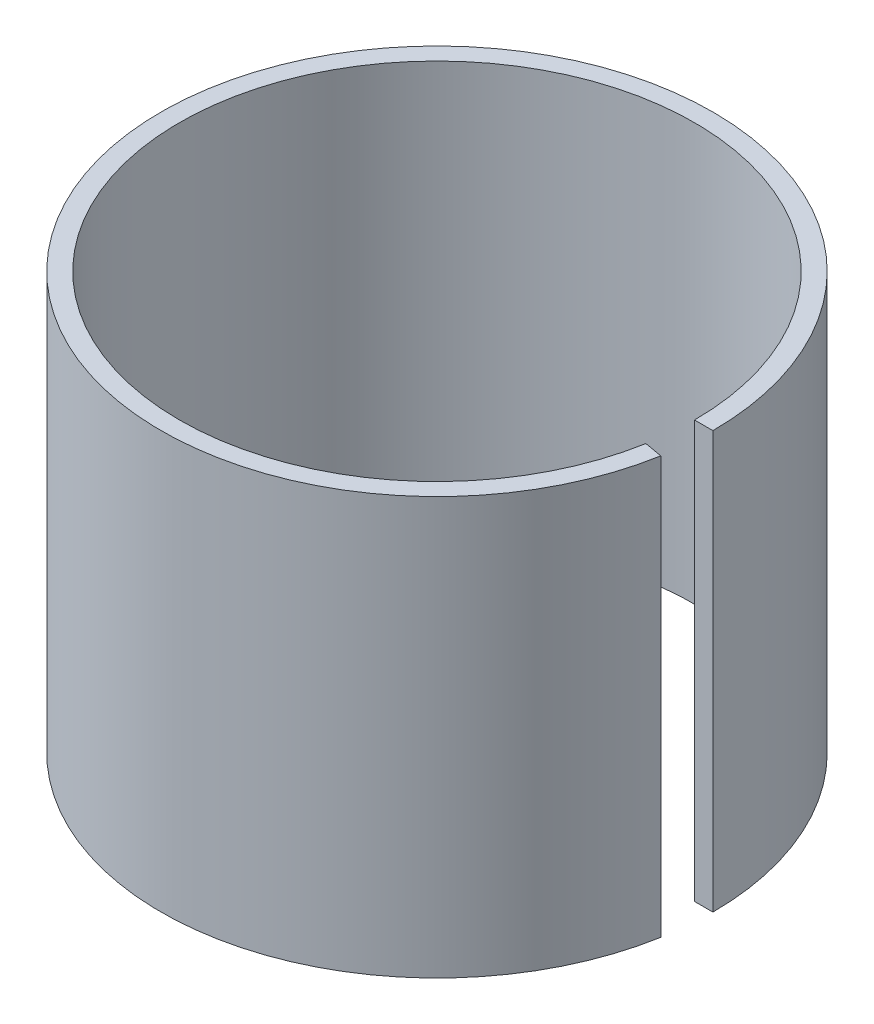
ISO-10303-21;
HEADER;
FILE_DESCRIPTION(('STEP AP214'),'2;1');
FILE_NAME('part.step','',(''),(''),'','','');
FILE_SCHEMA(('AUTOMOTIVE_DESIGN { 1 0 10303 214 1 1 1 1 }'));
ENDSEC;
DATA;
#1=APPLICATION_CONTEXT('core data for automotive mechanical design processes');
#2=APPLICATION_PROTOCOL_DEFINITION('international standard','automotive_design',2000,#1);
#3=PRODUCT_CONTEXT('',#1,'mechanical');
#4=PRODUCT('Part','Part','',(#3));
#5=PRODUCT_RELATED_PRODUCT_CATEGORY('part','',(#4));
#6=PRODUCT_DEFINITION_FORMATION('','',#4);
#7=PRODUCT_DEFINITION_CONTEXT('part definition',#1,'design');
#8=PRODUCT_DEFINITION('design','',#6,#7);
#9=PRODUCT_DEFINITION_SHAPE('','',#8);
#10=(LENGTH_UNIT() NAMED_UNIT(*) SI_UNIT(.MILLI.,.METRE.));
#11=(NAMED_UNIT(*) PLANE_ANGLE_UNIT() SI_UNIT($,.RADIAN.));
#12=(NAMED_UNIT(*) SI_UNIT($,.STERADIAN.) SOLID_ANGLE_UNIT());
#13=UNCERTAINTY_MEASURE_WITH_UNIT(LENGTH_MEASURE(1.E-05),#10,'distance_accuracy_value','');
#14=(GEOMETRIC_REPRESENTATION_CONTEXT(3) GLOBAL_UNCERTAINTY_ASSIGNED_CONTEXT((#13)) GLOBAL_UNIT_ASSIGNED_CONTEXT((#10,
#11,#12)) REPRESENTATION_CONTEXT('',''));
#15=CARTESIAN_POINT('',(0.,0.,0.));
#16=DIRECTION('',(0.,0.,1.));
#17=DIRECTION('',(1.,0.,0.));
#18=AXIS2_PLACEMENT_3D('',#15,#16,#17);
#19=CARTESIAN_POINT('',(0.,0.,0.));
#20=DIRECTION('',(0.,-1.,0.));
#21=DIRECTION('',(0.,0.,-1.));
#22=AXIS2_PLACEMENT_3D('',#19,#20,#21);
#23=CYLINDRICAL_SURFACE('',#22,22.5);
#24=CARTESIAN_POINT('',(0.,0.,0.));
#25=DIRECTION('',(0.,-1.,0.));
#26=DIRECTION('',(0.,0.,-1.));
#27=AXIS2_PLACEMENT_3D('',#24,#25,#26);
#28=CIRCLE('',#27,22.5);
#29=CARTESIAN_POINT('',(22.1581744427747,0.,3.90708399750564));
#30=VERTEX_POINT('',#29);
#31=CARTESIAN_POINT('',(22.5,0.,0.));
#32=VERTEX_POINT('',#31);
#33=EDGE_CURVE('E11',#30,#32,#28,.T.);
#34=ORIENTED_EDGE('',*,*,#33,.F.);
#35=DIRECTION('',(0.,1.,0.));
#36=VECTOR('',#35,1.);
#37=CARTESIAN_POINT('',(22.1581744427747,0.,3.90708399750564));
#38=LINE('',#37,#36);
#39=CARTESIAN_POINT('',(22.1581744427747,34.,3.90708399750564));
#40=VERTEX_POINT('',#39);
#41=EDGE_CURVE('E79',#30,#40,#38,.T.);
#42=ORIENTED_EDGE('',*,*,#41,.T.);
#43=CARTESIAN_POINT('',(0.,34.,0.));
#44=DIRECTION('',(0.,-1.,0.));
#45=DIRECTION('',(0.,0.,-1.));
#46=AXIS2_PLACEMENT_3D('',#43,#44,#45);
#47=CIRCLE('',#46,22.5);
#48=CARTESIAN_POINT('',(22.5,34.,0.));
#49=VERTEX_POINT('',#48);
#50=EDGE_CURVE('E74',#40,#49,#47,.T.);
#51=ORIENTED_EDGE('',*,*,#50,.T.);
#52=DIRECTION('',(0.,1.,0.));
#53=VECTOR('',#52,1.);
#54=CARTESIAN_POINT('',(22.5,0.,0.));
#55=LINE('',#54,#53);
#56=EDGE_CURVE('E77',#32,#49,#55,.T.);
#57=ORIENTED_EDGE('',*,*,#56,.F.);
#58=EDGE_LOOP('',(#34,#42,#51,#57));
#59=FACE_BOUND('',#58,.T.);
#60=ADVANCED_FACE('F38',(#59),#23,.T.);
#61=CARTESIAN_POINT('',(22.1581744427747,0.,3.90708399750564));
#62=DIRECTION('',(0.,1.,0.));
#63=DIRECTION('',(0.,0.,1.));
#64=AXIS2_PLACEMENT_3D('',#61,#62,#63);
#65=PLANE('',#64);
#66=CARTESIAN_POINT('',(0.,0.,0.));
#67=DIRECTION('',(0.,-1.,0.));
#68=DIRECTION('',(0.,0.,-1.));
#69=AXIS2_PLACEMENT_3D('',#66,#67,#68);
#70=CIRCLE('',#69,21.);
#71=CARTESIAN_POINT('',(20.6809628132564,0.,3.64661173100526));
#72=VERTEX_POINT('',#71);
#73=CARTESIAN_POINT('',(21.,0.,0.));
#74=VERTEX_POINT('',#73);
#75=EDGE_CURVE('E46',#72,#74,#70,.T.);
#76=ORIENTED_EDGE('',*,*,#75,.F.);
#77=DIRECTION('',(-0.98480775301221,0.,-0.173648177666917));
#78=VECTOR('',#77,1.);
#79=CARTESIAN_POINT('',(22.1581744427747,0.,3.90708399750564));
#80=LINE('',#79,#78);
#81=EDGE_CURVE('E84',#30,#72,#80,.T.);
#82=ORIENTED_EDGE('',*,*,#81,.F.);
#83=ORIENTED_EDGE('',*,*,#33,.T.);
#84=DIRECTION('',(-1.,0.,0.));
#85=VECTOR('',#84,1.);
#86=CARTESIAN_POINT('',(22.5,0.,0.));
#87=LINE('',#86,#85);
#88=EDGE_CURVE('E96',#32,#74,#87,.T.);
#89=ORIENTED_EDGE('',*,*,#88,.T.);
#90=EDGE_LOOP('',(#76,#82,#83,#89));
#91=FACE_BOUND('',#90,.T.);
#92=ADVANCED_FACE('F40',(#91),#65,.F.);
#93=CARTESIAN_POINT('',(0.,0.,0.));
#94=DIRECTION('',(0.,-1.,0.));
#95=DIRECTION('',(0.,0.,-1.));
#96=AXIS2_PLACEMENT_3D('',#93,#94,#95);
#97=CYLINDRICAL_SURFACE('',#96,21.);
#98=CARTESIAN_POINT('',(0.,34.,0.));
#99=DIRECTION('',(0.,-1.,0.));
#100=DIRECTION('',(0.,0.,-1.));
#101=AXIS2_PLACEMENT_3D('',#98,#99,#100);
#102=CIRCLE('',#101,21.);
#103=CARTESIAN_POINT('',(20.6809628132564,34.,3.64661173100526));
#104=VERTEX_POINT('',#103);
#105=CARTESIAN_POINT('',(21.,34.,0.));
#106=VERTEX_POINT('',#105);
#107=EDGE_CURVE('E83',#104,#106,#102,.T.);
#108=ORIENTED_EDGE('',*,*,#107,.F.);
#109=DIRECTION('',(0.,1.,0.));
#110=VECTOR('',#109,1.);
#111=CARTESIAN_POINT('',(20.6809628132564,0.,3.64661173100526));
#112=LINE('',#111,#110);
#113=EDGE_CURVE('E104',#72,#104,#112,.T.);
#114=ORIENTED_EDGE('',*,*,#113,.F.);
#115=ORIENTED_EDGE('',*,*,#75,.T.);
#116=DIRECTION('',(0.,1.,0.));
#117=VECTOR('',#116,1.);
#118=CARTESIAN_POINT('',(21.,0.,0.));
#119=LINE('',#118,#117);
#120=EDGE_CURVE('E92',#74,#106,#119,.T.);
#121=ORIENTED_EDGE('',*,*,#120,.T.);
#122=EDGE_LOOP('',(#108,#114,#115,#121));
#123=FACE_BOUND('',#122,.T.);
#124=ADVANCED_FACE('F110',(#123),#97,.F.);
#125=CARTESIAN_POINT('',(20.6809628132564,34.,3.64661173100526));
#126=DIRECTION('',(0.,-1.,0.));
#127=DIRECTION('',(0.,0.,-1.));
#128=AXIS2_PLACEMENT_3D('',#125,#126,#127);
#129=PLANE('',#128);
#130=DIRECTION('',(0.98480775301221,0.,0.173648177666917));
#131=VECTOR('',#130,1.);
#132=CARTESIAN_POINT('',(20.6809628132564,34.,3.64661173100526));
#133=LINE('',#132,#131);
#134=EDGE_CURVE('E102',#104,#40,#133,.T.);
#135=ORIENTED_EDGE('',*,*,#134,.F.);
#136=ORIENTED_EDGE('',*,*,#107,.T.);
#137=DIRECTION('',(1.,0.,0.));
#138=VECTOR('',#137,1.);
#139=CARTESIAN_POINT('',(21.,34.,0.));
#140=LINE('',#139,#138);
#141=EDGE_CURVE('E87',#106,#49,#140,.T.);
#142=ORIENTED_EDGE('',*,*,#141,.T.);
#143=ORIENTED_EDGE('',*,*,#50,.F.);
#144=EDGE_LOOP('',(#135,#136,#142,#143));
#145=FACE_BOUND('',#144,.T.);
#146=ADVANCED_FACE('F88',(#145),#129,.F.);
#147=CARTESIAN_POINT('',(0.,0.,0.));
#148=DIRECTION('',(0.173648177666917,0.,-0.98480775301221));
#149=DIRECTION('',(-0.98480775301221,0.,-0.173648177666917));
#150=AXIS2_PLACEMENT_3D('',#147,#148,#149);
#151=PLANE('',#150);
#152=ORIENTED_EDGE('',*,*,#41,.F.);
#153=ORIENTED_EDGE('',*,*,#81,.T.);
#154=ORIENTED_EDGE('',*,*,#113,.T.);
#155=ORIENTED_EDGE('',*,*,#134,.T.);
#156=EDGE_LOOP('',(#152,#153,#154,#155));
#157=FACE_BOUND('',#156,.T.);
#158=ADVANCED_FACE('F112',(#157),#151,.T.);
#159=CARTESIAN_POINT('',(0.,0.,0.));
#160=DIRECTION('',(0.,0.,-1.));
#161=DIRECTION('',(-1.,0.,0.));
#162=AXIS2_PLACEMENT_3D('',#159,#160,#161);
#163=PLANE('',#162);
#164=ORIENTED_EDGE('',*,*,#56,.T.);
#165=ORIENTED_EDGE('',*,*,#141,.F.);
#166=ORIENTED_EDGE('',*,*,#120,.F.);
#167=ORIENTED_EDGE('',*,*,#88,.F.);
#168=EDGE_LOOP('',(#164,#165,#166,#167));
#169=FACE_BOUND('',#168,.T.);
#170=ADVANCED_FACE('F95',(#169),#163,.F.);
#171=CLOSED_SHELL('',(#60,#92,#124,#146,#158,#170));
#172=MANIFOLD_SOLID_BREP('B2',#171);
#173=ADVANCED_BREP_SHAPE_REPRESENTATION('',(#18,#172),#14);
#174=SHAPE_DEFINITION_REPRESENTATION(#9,#173);
ENDSEC;
END-ISO-10303-21;
